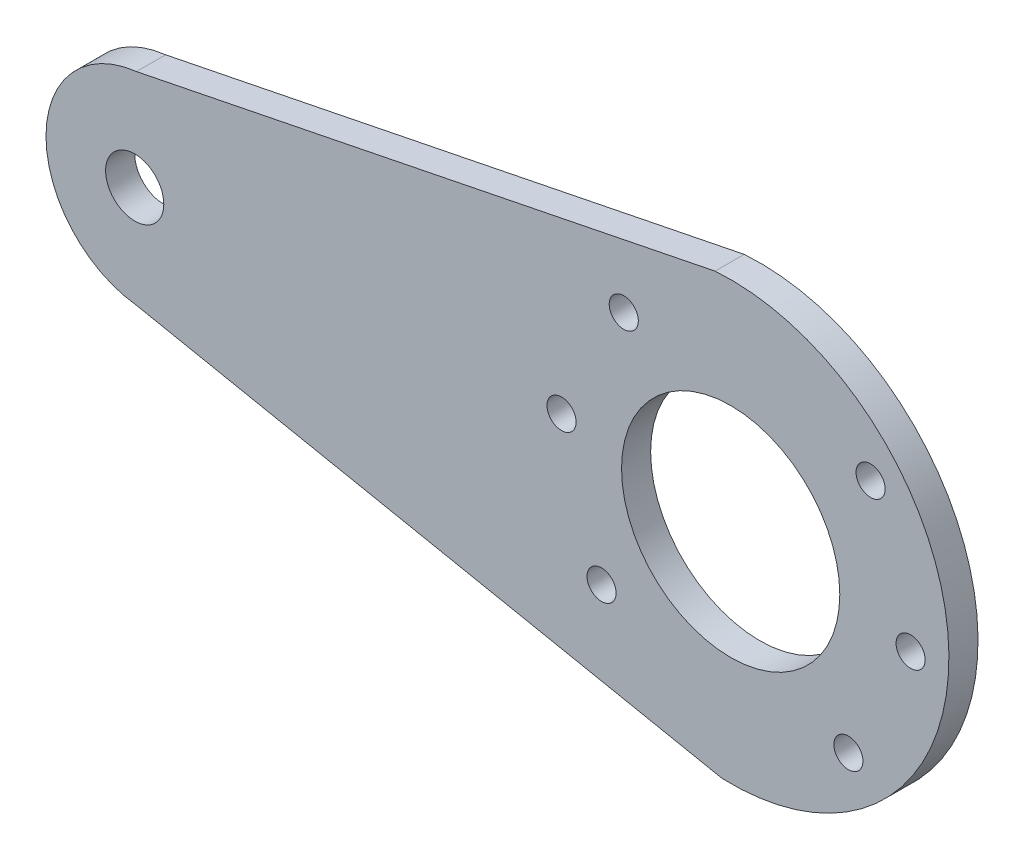
ISO-10303-21;
HEADER;
FILE_DESCRIPTION(('STEP AP214'),'2;1');
FILE_NAME('part.step','',(''),(''),'','','');
FILE_SCHEMA(('AUTOMOTIVE_DESIGN { 1 0 10303 214 1 1 1 1 }'));
ENDSEC;
DATA;
#1=APPLICATION_CONTEXT('core data for automotive mechanical design processes');
#2=APPLICATION_PROTOCOL_DEFINITION('international standard','automotive_design',2000,#1);
#3=PRODUCT_CONTEXT('',#1,'mechanical');
#4=PRODUCT('Part','Part','',(#3));
#5=PRODUCT_RELATED_PRODUCT_CATEGORY('part','',(#4));
#6=PRODUCT_DEFINITION_FORMATION('','',#4);
#7=PRODUCT_DEFINITION_CONTEXT('part definition',#1,'design');
#8=PRODUCT_DEFINITION('design','',#6,#7);
#9=PRODUCT_DEFINITION_SHAPE('','',#8);
#10=(LENGTH_UNIT() NAMED_UNIT(*) SI_UNIT(.MILLI.,.METRE.));
#11=(NAMED_UNIT(*) PLANE_ANGLE_UNIT() SI_UNIT($,.RADIAN.));
#12=(NAMED_UNIT(*) SI_UNIT($,.STERADIAN.) SOLID_ANGLE_UNIT());
#13=UNCERTAINTY_MEASURE_WITH_UNIT(LENGTH_MEASURE(1.E-05),#10,'distance_accuracy_value','');
#14=(GEOMETRIC_REPRESENTATION_CONTEXT(3) GLOBAL_UNCERTAINTY_ASSIGNED_CONTEXT((#13)) GLOBAL_UNIT_ASSIGNED_CONTEXT((#10,
#11,#12)) REPRESENTATION_CONTEXT('',''));
#15=CARTESIAN_POINT('',(0.,0.,0.));
#16=DIRECTION('',(0.,0.,1.));
#17=DIRECTION('',(1.,0.,0.));
#18=AXIS2_PLACEMENT_3D('',#15,#16,#17);
#19=CARTESIAN_POINT('',(-80.1094274649265,0.,2.));
#20=DIRECTION('',(0.,0.,1.));
#21=DIRECTION('',(1.,0.,0.));
#22=AXIS2_PLACEMENT_3D('',#19,#20,#21);
#23=PLANE('',#22);
#24=CARTESIAN_POINT('',(16.1808751591071,-18.2579999084932,2.));
#25=DIRECTION('',(0.,0.,1.));
#26=DIRECTION('',(1.,0.,0.));
#27=AXIS2_PLACEMENT_3D('',#24,#25,#26);
#28=CIRCLE('',#27,2.00000000000001);
#29=CARTESIAN_POINT('',(18.1808751591071,-18.2579999084932,2.));
#30=VERTEX_POINT('',#29);
#31=EDGE_CURVE('E152',#30,#30,#28,.T.);
#32=ORIENTED_EDGE('',*,*,#31,.F.);
#33=EDGE_LOOP('',(#32));
#34=FACE_BOUND('',#33,.T.);
#35=CARTESIAN_POINT('',(24.7339600527011,-1.92628661877464,2.));
#36=DIRECTION('',(0.,0.,1.));
#37=DIRECTION('',(1.,0.,0.));
#38=AXIS2_PLACEMENT_3D('',#35,#36,#37);
#39=CIRCLE('',#38,2.00000000000001);
#40=CARTESIAN_POINT('',(26.7339600527011,-1.92628661877464,2.));
#41=VERTEX_POINT('',#40);
#42=EDGE_CURVE('E146',#41,#41,#39,.T.);
#43=ORIENTED_EDGE('',*,*,#42,.F.);
#44=EDGE_LOOP('',(#43));
#45=FACE_BOUND('',#44,.T.);
#46=CARTESIAN_POINT('',(19.2336391654712,15.6699229251044,2.));
#47=DIRECTION('',(0.,0.,1.));
#48=DIRECTION('',(1.,0.,0.));
#49=AXIS2_PLACEMENT_3D('',#46,#47,#48);
#50=CIRCLE('',#49,2.);
#51=CARTESIAN_POINT('',(21.2336391654712,15.6699229251044,2.));
#52=VERTEX_POINT('',#51);
#53=EDGE_CURVE('E140',#52,#52,#50,.T.);
#54=ORIENTED_EDGE('',*,*,#53,.F.);
#55=EDGE_LOOP('',(#54));
#56=FACE_BOUND('',#55,.T.);
#57=CARTESIAN_POINT('',(-14.6942836681264,18.7226869314685,2.));
#58=DIRECTION('',(0.,0.,1.));
#59=DIRECTION('',(1.,0.,0.));
#60=AXIS2_PLACEMENT_3D('',#57,#58,#59);
#61=CIRCLE('',#60,2.00000000000001);
#62=CARTESIAN_POINT('',(-12.6942836681264,18.7226869314685,2.));
#63=VERTEX_POINT('',#62);
#64=EDGE_CURVE('E134',#63,#63,#61,.T.);
#65=ORIENTED_EDGE('',*,*,#64,.F.);
#66=EDGE_LOOP('',(#65));
#67=FACE_BOUND('',#66,.T.);
#68=CARTESIAN_POINT('',(-23.2473685617205,2.39097364174993,2.));
#69=DIRECTION('',(0.,0.,1.));
#70=DIRECTION('',(1.,0.,0.));
#71=AXIS2_PLACEMENT_3D('',#68,#69,#70);
#72=CIRCLE('',#71,2.);
#73=CARTESIAN_POINT('',(-21.2473685617205,2.39097364174993,2.));
#74=VERTEX_POINT('',#73);
#75=EDGE_CURVE('E128',#74,#74,#72,.T.);
#76=ORIENTED_EDGE('',*,*,#75,.F.);
#77=EDGE_LOOP('',(#76));
#78=FACE_BOUND('',#77,.T.);
#79=CARTESIAN_POINT('',(-17.7470476744906,-15.2052359021291,2.));
#80=DIRECTION('',(0.,0.,1.));
#81=DIRECTION('',(1.,0.,0.));
#82=AXIS2_PLACEMENT_3D('',#79,#80,#81);
#83=CIRCLE('',#82,2.);
#84=CARTESIAN_POINT('',(-15.7470476744906,-15.2052359021291,2.));
#85=VERTEX_POINT('',#84);
#86=EDGE_CURVE('E122',#85,#85,#83,.T.);
#87=ORIENTED_EDGE('',*,*,#86,.F.);
#88=EDGE_LOOP('',(#87));
#89=FACE_BOUND('',#88,.T.);
#90=CARTESIAN_POINT('',(0.,0.,2.));
#91=DIRECTION('',(0.,0.,1.));
#92=DIRECTION('',(1.,0.,0.));
#93=AXIS2_PLACEMENT_3D('',#90,#91,#92);
#94=CIRCLE('',#93,15.);
#95=CARTESIAN_POINT('',(15.,0.,2.));
#96=VERTEX_POINT('',#95);
#97=EDGE_CURVE('E98',#96,#96,#94,.T.);
#98=ORIENTED_EDGE('',*,*,#97,.F.);
#99=EDGE_LOOP('',(#98));
#100=FACE_BOUND('',#99,.T.);
#101=CARTESIAN_POINT('',(-80.1094274649265,0.,2.));
#102=DIRECTION('',(0.,0.,1.));
#103=DIRECTION('',(1.,0.,0.));
#104=AXIS2_PLACEMENT_3D('',#101,#102,#103);
#105=CIRCLE('',#104,14.);
#106=CARTESIAN_POINT('',(-81.6768461746434,13.9119803977877,2.));
#107=VERTEX_POINT('',#106);
#108=CARTESIAN_POINT('',(-81.7023255168503,-13.9090860877406,2.));
#109=VERTEX_POINT('',#108);
#110=EDGE_CURVE('E83',#107,#109,#105,.T.);
#111=ORIENTED_EDGE('',*,*,#110,.T.);
#112=DIRECTION('',(0.980659011610517,-0.195724047952936,0.));
#113=VECTOR('',#112,1.);
#114=CARTESIAN_POINT('',(-81.7023255168503,-13.9090860877406,2.));
#115=LINE('',#114,#113);
#116=CARTESIAN_POINT('',(-1.2005530254682,-29.975968248466,2.));
#117=VERTEX_POINT('',#116);
#118=EDGE_CURVE('E78',#109,#117,#115,.T.);
#119=ORIENTED_EDGE('',*,*,#118,.T.);
#120=CARTESIAN_POINT('',(0.,0.,2.));
#121=DIRECTION('',(0.,0.,1.));
#122=DIRECTION('',(1.,0.,0.));
#123=AXIS2_PLACEMENT_3D('',#120,#121,#122);
#124=CIRCLE('',#123,30.);
#125=CARTESIAN_POINT('',(-2.13800287982571,29.9237187476065,2.));
#126=VERTEX_POINT('',#125);
#127=EDGE_CURVE('E81',#117,#126,#124,.T.);
#128=ORIENTED_EDGE('',*,*,#127,.T.);
#129=DIRECTION('',(-0.980333469053505,-0.197348142766839,0.));
#130=VECTOR('',#129,1.);
#131=CARTESIAN_POINT('',(-81.6768461746434,13.9119803977877,2.));
#132=LINE('',#131,#130);
#133=EDGE_CURVE('E48',#126,#107,#132,.T.);
#134=ORIENTED_EDGE('',*,*,#133,.T.);
#135=EDGE_LOOP('',(#111,#119,#128,#134));
#136=FACE_BOUND('',#135,.T.);
#137=CARTESIAN_POINT('',(-81.9176418481679,0.,2.));
#138=DIRECTION('',(0.,0.,1.));
#139=DIRECTION('',(1.,0.,0.));
#140=AXIS2_PLACEMENT_3D('',#137,#138,#139);
#141=CIRCLE('',#140,4.00000000000001);
#142=CARTESIAN_POINT('',(-77.9176418481679,0.,2.));
#143=VERTEX_POINT('',#142);
#144=EDGE_CURVE('E113',#143,#143,#141,.T.);
#145=ORIENTED_EDGE('',*,*,#144,.F.);
#146=EDGE_LOOP('',(#145));
#147=FACE_BOUND('',#146,.T.);
#148=ADVANCED_FACE('F31',(#34,#45,#56,#67,#78,#89,#100,#136,#147),#23,.T.);
#149=CARTESIAN_POINT('',(-80.1094274649265,0.,-2.));
#150=DIRECTION('',(0.,0.,1.));
#151=DIRECTION('',(1.,0.,0.));
#152=AXIS2_PLACEMENT_3D('',#149,#150,#151);
#153=PLANE('',#152);
#154=CARTESIAN_POINT('',(16.1808751591071,-18.2579999084932,-2.));
#155=DIRECTION('',(0.,0.,1.));
#156=DIRECTION('',(1.,0.,0.));
#157=AXIS2_PLACEMENT_3D('',#154,#155,#156);
#158=CIRCLE('',#157,2.00000000000001);
#159=CARTESIAN_POINT('',(18.1808751591071,-18.2579999084932,-2.));
#160=VERTEX_POINT('',#159);
#161=EDGE_CURVE('E149',#160,#160,#158,.T.);
#162=ORIENTED_EDGE('',*,*,#161,.T.);
#163=EDGE_LOOP('',(#162));
#164=FACE_BOUND('',#163,.T.);
#165=CARTESIAN_POINT('',(24.7339600527011,-1.92628661877464,-2.));
#166=DIRECTION('',(0.,0.,1.));
#167=DIRECTION('',(1.,0.,0.));
#168=AXIS2_PLACEMENT_3D('',#165,#166,#167);
#169=CIRCLE('',#168,2.00000000000001);
#170=CARTESIAN_POINT('',(26.7339600527011,-1.92628661877464,-2.));
#171=VERTEX_POINT('',#170);
#172=EDGE_CURVE('E143',#171,#171,#169,.T.);
#173=ORIENTED_EDGE('',*,*,#172,.T.);
#174=EDGE_LOOP('',(#173));
#175=FACE_BOUND('',#174,.T.);
#176=CARTESIAN_POINT('',(19.2336391654712,15.6699229251044,-2.));
#177=DIRECTION('',(0.,0.,1.));
#178=DIRECTION('',(1.,0.,0.));
#179=AXIS2_PLACEMENT_3D('',#176,#177,#178);
#180=CIRCLE('',#179,2.);
#181=CARTESIAN_POINT('',(21.2336391654712,15.6699229251044,-2.));
#182=VERTEX_POINT('',#181);
#183=EDGE_CURVE('E137',#182,#182,#180,.T.);
#184=ORIENTED_EDGE('',*,*,#183,.T.);
#185=EDGE_LOOP('',(#184));
#186=FACE_BOUND('',#185,.T.);
#187=CARTESIAN_POINT('',(-14.6942836681264,18.7226869314685,-2.));
#188=DIRECTION('',(0.,0.,1.));
#189=DIRECTION('',(1.,0.,0.));
#190=AXIS2_PLACEMENT_3D('',#187,#188,#189);
#191=CIRCLE('',#190,2.00000000000001);
#192=CARTESIAN_POINT('',(-12.6942836681264,18.7226869314685,-2.));
#193=VERTEX_POINT('',#192);
#194=EDGE_CURVE('E131',#193,#193,#191,.T.);
#195=ORIENTED_EDGE('',*,*,#194,.T.);
#196=EDGE_LOOP('',(#195));
#197=FACE_BOUND('',#196,.T.);
#198=CARTESIAN_POINT('',(-23.2473685617205,2.39097364174993,-2.));
#199=DIRECTION('',(0.,0.,1.));
#200=DIRECTION('',(1.,0.,0.));
#201=AXIS2_PLACEMENT_3D('',#198,#199,#200);
#202=CIRCLE('',#201,2.);
#203=CARTESIAN_POINT('',(-21.2473685617205,2.39097364174993,-2.));
#204=VERTEX_POINT('',#203);
#205=EDGE_CURVE('E125',#204,#204,#202,.T.);
#206=ORIENTED_EDGE('',*,*,#205,.T.);
#207=EDGE_LOOP('',(#206));
#208=FACE_BOUND('',#207,.T.);
#209=CARTESIAN_POINT('',(-17.7470476744906,-15.2052359021291,-2.));
#210=DIRECTION('',(0.,0.,1.));
#211=DIRECTION('',(1.,0.,0.));
#212=AXIS2_PLACEMENT_3D('',#209,#210,#211);
#213=CIRCLE('',#212,2.);
#214=CARTESIAN_POINT('',(-15.7470476744906,-15.2052359021291,-2.));
#215=VERTEX_POINT('',#214);
#216=EDGE_CURVE('E119',#215,#215,#213,.T.);
#217=ORIENTED_EDGE('',*,*,#216,.T.);
#218=EDGE_LOOP('',(#217));
#219=FACE_BOUND('',#218,.T.);
#220=CARTESIAN_POINT('',(0.,0.,-2.));
#221=DIRECTION('',(0.,0.,1.));
#222=DIRECTION('',(1.,0.,0.));
#223=AXIS2_PLACEMENT_3D('',#220,#221,#222);
#224=CIRCLE('',#223,15.);
#225=CARTESIAN_POINT('',(15.,0.,-2.));
#226=VERTEX_POINT('',#225);
#227=EDGE_CURVE('E110',#226,#226,#224,.T.);
#228=ORIENTED_EDGE('',*,*,#227,.T.);
#229=EDGE_LOOP('',(#228));
#230=FACE_BOUND('',#229,.T.);
#231=CARTESIAN_POINT('',(-80.1094274649265,0.,-2.));
#232=DIRECTION('',(0.,0.,1.));
#233=DIRECTION('',(1.,0.,0.));
#234=AXIS2_PLACEMENT_3D('',#231,#232,#233);
#235=CIRCLE('',#234,14.);
#236=CARTESIAN_POINT('',(-81.6768461746434,13.9119803977877,-2.));
#237=VERTEX_POINT('',#236);
#238=CARTESIAN_POINT('',(-81.7023255168503,-13.9090860877406,-2.));
#239=VERTEX_POINT('',#238);
#240=EDGE_CURVE('E95',#237,#239,#235,.T.);
#241=ORIENTED_EDGE('',*,*,#240,.F.);
#242=DIRECTION('',(-0.980333469053505,-0.197348142766839,0.));
#243=VECTOR('',#242,1.);
#244=CARTESIAN_POINT('',(-81.6768461746434,13.9119803977877,-2.));
#245=LINE('',#244,#243);
#246=CARTESIAN_POINT('',(-2.13800287982571,29.9237187476065,-2.));
#247=VERTEX_POINT('',#246);
#248=EDGE_CURVE('E71',#247,#237,#245,.T.);
#249=ORIENTED_EDGE('',*,*,#248,.F.);
#250=CARTESIAN_POINT('',(0.,0.,-2.));
#251=DIRECTION('',(0.,0.,1.));
#252=DIRECTION('',(1.,0.,0.));
#253=AXIS2_PLACEMENT_3D('',#250,#251,#252);
#254=CIRCLE('',#253,30.);
#255=CARTESIAN_POINT('',(-1.2005530254682,-29.975968248466,-2.));
#256=VERTEX_POINT('',#255);
#257=EDGE_CURVE('E65',#256,#247,#254,.T.);
#258=ORIENTED_EDGE('',*,*,#257,.F.);
#259=DIRECTION('',(0.980659011610517,-0.195724047952936,0.));
#260=VECTOR('',#259,1.);
#261=CARTESIAN_POINT('',(-81.7023255168503,-13.9090860877406,-2.));
#262=LINE('',#261,#260);
#263=EDGE_CURVE('E87',#239,#256,#262,.T.);
#264=ORIENTED_EDGE('',*,*,#263,.F.);
#265=EDGE_LOOP('',(#241,#249,#258,#264));
#266=FACE_BOUND('',#265,.T.);
#267=CARTESIAN_POINT('',(-81.9176418481679,0.,-2.));
#268=DIRECTION('',(0.,0.,1.));
#269=DIRECTION('',(1.,0.,0.));
#270=AXIS2_PLACEMENT_3D('',#267,#268,#269);
#271=CIRCLE('',#270,4.00000000000001);
#272=CARTESIAN_POINT('',(-77.9176418481679,0.,-2.));
#273=VERTEX_POINT('',#272);
#274=EDGE_CURVE('E116',#273,#273,#271,.T.);
#275=ORIENTED_EDGE('',*,*,#274,.T.);
#276=EDGE_LOOP('',(#275));
#277=FACE_BOUND('',#276,.T.);
#278=ADVANCED_FACE('F106',(#164,#175,#186,#197,#208,#219,#230,#266,#277),#153,.F.);
#279=CARTESIAN_POINT('',(-80.1094274649265,0.,2.));
#280=DIRECTION('',(0.,0.,-1.));
#281=DIRECTION('',(-1.,0.,0.));
#282=AXIS2_PLACEMENT_3D('',#279,#280,#281);
#283=CYLINDRICAL_SURFACE('',#282,14.);
#284=ORIENTED_EDGE('',*,*,#240,.T.);
#285=DIRECTION('',(0.,0.,-1.));
#286=VECTOR('',#285,1.);
#287=CARTESIAN_POINT('',(-81.7023255168503,-13.9090860877406,2.));
#288=LINE('',#287,#286);
#289=EDGE_CURVE('E11',#109,#239,#288,.T.);
#290=ORIENTED_EDGE('',*,*,#289,.F.);
#291=ORIENTED_EDGE('',*,*,#110,.F.);
#292=DIRECTION('',(0.,0.,-1.));
#293=VECTOR('',#292,1.);
#294=CARTESIAN_POINT('',(-81.6768461746434,13.9119803977877,2.));
#295=LINE('',#294,#293);
#296=EDGE_CURVE('E91',#107,#237,#295,.T.);
#297=ORIENTED_EDGE('',*,*,#296,.T.);
#298=EDGE_LOOP('',(#284,#290,#291,#297));
#299=FACE_BOUND('',#298,.T.);
#300=ADVANCED_FACE('F33',(#299),#283,.T.);
#301=CARTESIAN_POINT('',(-81.7023255168503,-13.9090860877406,2.));
#302=DIRECTION('',(0.195724047952936,0.980659011610517,0.));
#303=DIRECTION('',(-0.980659011610517,0.195724047952936,0.));
#304=AXIS2_PLACEMENT_3D('',#301,#302,#303);
#305=PLANE('',#304);
#306=ORIENTED_EDGE('',*,*,#263,.T.);
#307=DIRECTION('',(0.,0.,-1.));
#308=VECTOR('',#307,1.);
#309=CARTESIAN_POINT('',(-1.2005530254682,-29.975968248466,2.));
#310=LINE('',#309,#308);
#311=EDGE_CURVE('E40',#117,#256,#310,.T.);
#312=ORIENTED_EDGE('',*,*,#311,.F.);
#313=ORIENTED_EDGE('',*,*,#118,.F.);
#314=ORIENTED_EDGE('',*,*,#289,.T.);
#315=EDGE_LOOP('',(#306,#312,#313,#314));
#316=FACE_BOUND('',#315,.T.);
#317=ADVANCED_FACE('F86',(#316),#305,.F.);
#318=CARTESIAN_POINT('',(0.,0.,2.));
#319=DIRECTION('',(0.,0.,-1.));
#320=DIRECTION('',(-1.,0.,0.));
#321=AXIS2_PLACEMENT_3D('',#318,#319,#320);
#322=CYLINDRICAL_SURFACE('',#321,30.);
#323=ORIENTED_EDGE('',*,*,#257,.T.);
#324=DIRECTION('',(0.,0.,-1.));
#325=VECTOR('',#324,1.);
#326=CARTESIAN_POINT('',(-2.13800287982571,29.9237187476065,2.));
#327=LINE('',#326,#325);
#328=EDGE_CURVE('E88',#126,#247,#327,.T.);
#329=ORIENTED_EDGE('',*,*,#328,.F.);
#330=ORIENTED_EDGE('',*,*,#127,.F.);
#331=ORIENTED_EDGE('',*,*,#311,.T.);
#332=EDGE_LOOP('',(#323,#329,#330,#331));
#333=FACE_BOUND('',#332,.T.);
#334=ADVANCED_FACE('F89',(#333),#322,.T.);
#335=CARTESIAN_POINT('',(-81.6768461746434,13.9119803977877,2.));
#336=DIRECTION('',(0.197348142766839,-0.980333469053505,0.));
#337=DIRECTION('',(0.980333469053505,0.197348142766839,0.));
#338=AXIS2_PLACEMENT_3D('',#335,#336,#337);
#339=PLANE('',#338);
#340=ORIENTED_EDGE('',*,*,#248,.T.);
#341=ORIENTED_EDGE('',*,*,#296,.F.);
#342=ORIENTED_EDGE('',*,*,#133,.F.);
#343=ORIENTED_EDGE('',*,*,#328,.T.);
#344=EDGE_LOOP('',(#340,#341,#342,#343));
#345=FACE_BOUND('',#344,.T.);
#346=ADVANCED_FACE('F103',(#345),#339,.F.);
#347=CARTESIAN_POINT('',(0.,0.,2.));
#348=DIRECTION('',(0.,0.,-1.));
#349=DIRECTION('',(-1.,0.,0.));
#350=AXIS2_PLACEMENT_3D('',#347,#348,#349);
#351=CYLINDRICAL_SURFACE('',#350,15.);
#352=ORIENTED_EDGE('',*,*,#97,.T.);
#353=EDGE_LOOP('',(#352));
#354=FACE_BOUND('',#353,.T.);
#355=ORIENTED_EDGE('',*,*,#227,.F.);
#356=EDGE_LOOP('',(#355));
#357=FACE_BOUND('',#356,.T.);
#358=ADVANCED_FACE('F182',(#354,#357),#351,.F.);
#359=CARTESIAN_POINT('',(-81.9176418481679,0.,2.));
#360=DIRECTION('',(0.,0.,-1.));
#361=DIRECTION('',(-1.,0.,0.));
#362=AXIS2_PLACEMENT_3D('',#359,#360,#361);
#363=CYLINDRICAL_SURFACE('',#362,4.00000000000001);
#364=ORIENTED_EDGE('',*,*,#144,.T.);
#365=EDGE_LOOP('',(#364));
#366=FACE_BOUND('',#365,.T.);
#367=ORIENTED_EDGE('',*,*,#274,.F.);
#368=EDGE_LOOP('',(#367));
#369=FACE_BOUND('',#368,.T.);
#370=ADVANCED_FACE('F185',(#366,#369),#363,.F.);
#371=CARTESIAN_POINT('',(-17.7470476744906,-15.2052359021291,-2.));
#372=DIRECTION('',(0.,0.,1.));
#373=DIRECTION('',(1.,0.,0.));
#374=AXIS2_PLACEMENT_3D('',#371,#372,#373);
#375=CYLINDRICAL_SURFACE('',#374,2.);
#376=ORIENTED_EDGE('',*,*,#216,.F.);
#377=EDGE_LOOP('',(#376));
#378=FACE_BOUND('',#377,.T.);
#379=ORIENTED_EDGE('',*,*,#86,.T.);
#380=EDGE_LOOP('',(#379));
#381=FACE_BOUND('',#380,.T.);
#382=ADVANCED_FACE('F222',(#378,#381),#375,.F.);
#383=CARTESIAN_POINT('',(-23.2473685617205,2.39097364174993,-2.));
#384=DIRECTION('',(0.,0.,1.));
#385=DIRECTION('',(1.,0.,0.));
#386=AXIS2_PLACEMENT_3D('',#383,#384,#385);
#387=CYLINDRICAL_SURFACE('',#386,2.);
#388=ORIENTED_EDGE('',*,*,#205,.F.);
#389=EDGE_LOOP('',(#388));
#390=FACE_BOUND('',#389,.T.);
#391=ORIENTED_EDGE('',*,*,#75,.T.);
#392=EDGE_LOOP('',(#391));
#393=FACE_BOUND('',#392,.T.);
#394=ADVANCED_FACE('F229',(#390,#393),#387,.F.);
#395=CARTESIAN_POINT('',(-14.6942836681264,18.7226869314685,-2.));
#396=DIRECTION('',(0.,0.,1.));
#397=DIRECTION('',(1.,0.,0.));
#398=AXIS2_PLACEMENT_3D('',#395,#396,#397);
#399=CYLINDRICAL_SURFACE('',#398,2.00000000000001);
#400=ORIENTED_EDGE('',*,*,#194,.F.);
#401=EDGE_LOOP('',(#400));
#402=FACE_BOUND('',#401,.T.);
#403=ORIENTED_EDGE('',*,*,#64,.T.);
#404=EDGE_LOOP('',(#403));
#405=FACE_BOUND('',#404,.T.);
#406=ADVANCED_FACE('F237',(#402,#405),#399,.F.);
#407=CARTESIAN_POINT('',(19.2336391654712,15.6699229251044,-2.));
#408=DIRECTION('',(0.,0.,1.));
#409=DIRECTION('',(1.,0.,0.));
#410=AXIS2_PLACEMENT_3D('',#407,#408,#409);
#411=CYLINDRICAL_SURFACE('',#410,2.);
#412=ORIENTED_EDGE('',*,*,#183,.F.);
#413=EDGE_LOOP('',(#412));
#414=FACE_BOUND('',#413,.T.);
#415=ORIENTED_EDGE('',*,*,#53,.T.);
#416=EDGE_LOOP('',(#415));
#417=FACE_BOUND('',#416,.T.);
#418=ADVANCED_FACE('F245',(#414,#417),#411,.F.);
#419=CARTESIAN_POINT('',(24.7339600527011,-1.92628661877464,-2.));
#420=DIRECTION('',(0.,0.,1.));
#421=DIRECTION('',(1.,0.,0.));
#422=AXIS2_PLACEMENT_3D('',#419,#420,#421);
#423=CYLINDRICAL_SURFACE('',#422,2.00000000000001);
#424=ORIENTED_EDGE('',*,*,#172,.F.);
#425=EDGE_LOOP('',(#424));
#426=FACE_BOUND('',#425,.T.);
#427=ORIENTED_EDGE('',*,*,#42,.T.);
#428=EDGE_LOOP('',(#427));
#429=FACE_BOUND('',#428,.T.);
#430=ADVANCED_FACE('F163',(#426,#429),#423,.F.);
#431=CARTESIAN_POINT('',(16.1808751591071,-18.2579999084932,-2.));
#432=DIRECTION('',(0.,0.,1.));
#433=DIRECTION('',(1.,0.,0.));
#434=AXIS2_PLACEMENT_3D('',#431,#432,#433);
#435=CYLINDRICAL_SURFACE('',#434,2.00000000000001);
#436=ORIENTED_EDGE('',*,*,#161,.F.);
#437=EDGE_LOOP('',(#436));
#438=FACE_BOUND('',#437,.T.);
#439=ORIENTED_EDGE('',*,*,#31,.T.);
#440=EDGE_LOOP('',(#439));
#441=FACE_BOUND('',#440,.T.);
#442=ADVANCED_FACE('F160',(#438,#441),#435,.F.);
#443=CLOSED_SHELL('',(#148,#278,#300,#317,#334,#346,#358,#370,#382,#394,#406,#418,#430,#442));
#444=MANIFOLD_SOLID_BREP('B2',#443);
#445=ADVANCED_BREP_SHAPE_REPRESENTATION('',(#18,#444),#14);
#446=SHAPE_DEFINITION_REPRESENTATION(#9,#445);
ENDSEC;
END-ISO-10303-21;
